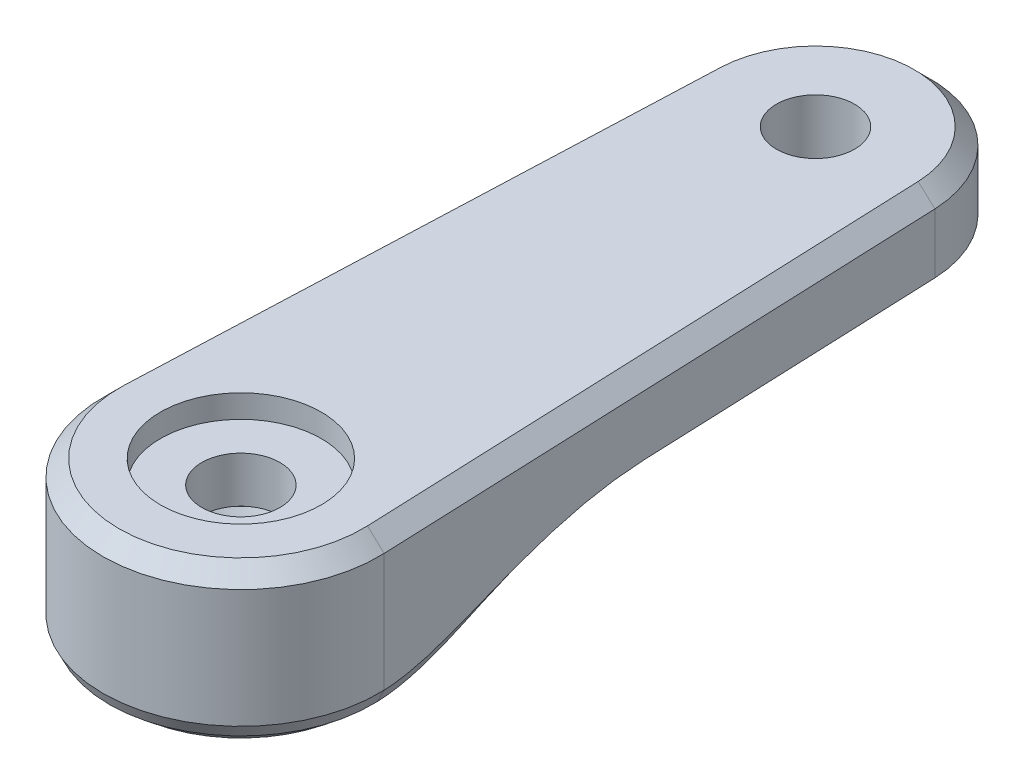
ISO-10303-21;
HEADER;
FILE_DESCRIPTION(('STEP AP214'),'2;1');
FILE_NAME('part.step','',(''),(''),'','','');
FILE_SCHEMA(('AUTOMOTIVE_DESIGN { 1 0 10303 214 1 1 1 1 }'));
ENDSEC;
DATA;
#1=APPLICATION_CONTEXT('core data for automotive mechanical design processes');
#2=APPLICATION_PROTOCOL_DEFINITION('international standard','automotive_design',2000,#1);
#3=PRODUCT_CONTEXT('',#1,'mechanical');
#4=PRODUCT('Part','Part','',(#3));
#5=PRODUCT_RELATED_PRODUCT_CATEGORY('part','',(#4));
#6=PRODUCT_DEFINITION_FORMATION('','',#4);
#7=PRODUCT_DEFINITION_CONTEXT('part definition',#1,'design');
#8=PRODUCT_DEFINITION('design','',#6,#7);
#9=PRODUCT_DEFINITION_SHAPE('','',#8);
#10=(LENGTH_UNIT() NAMED_UNIT(*) SI_UNIT(.MILLI.,.METRE.));
#11=(NAMED_UNIT(*) PLANE_ANGLE_UNIT() SI_UNIT($,.RADIAN.));
#12=(NAMED_UNIT(*) SI_UNIT($,.STERADIAN.) SOLID_ANGLE_UNIT());
#13=UNCERTAINTY_MEASURE_WITH_UNIT(LENGTH_MEASURE(1.E-05),#10,'distance_accuracy_value','');
#14=(GEOMETRIC_REPRESENTATION_CONTEXT(3) GLOBAL_UNCERTAINTY_ASSIGNED_CONTEXT((#13)) GLOBAL_UNIT_ASSIGNED_CONTEXT((#10,
#11,#12)) REPRESENTATION_CONTEXT('',''));
#15=CARTESIAN_POINT('',(0.,0.,0.));
#16=DIRECTION('',(0.,0.,1.));
#17=DIRECTION('',(1.,0.,0.));
#18=AXIS2_PLACEMENT_3D('',#15,#16,#17);
#19=CARTESIAN_POINT('',(0.,1.,0.));
#20=DIRECTION('',(0.,-1.,0.));
#21=DIRECTION('',(0.,0.,-1.));
#22=AXIS2_PLACEMENT_3D('',#19,#20,#21);
#23=CYLINDRICAL_SURFACE('',#22,3.25);
#24=CARTESIAN_POINT('',(0.,0.,0.));
#25=DIRECTION('',(0.,1.,0.));
#26=DIRECTION('',(0.,0.,1.));
#27=AXIS2_PLACEMENT_3D('',#24,#25,#26);
#28=CIRCLE('',#27,3.25);
#29=CARTESIAN_POINT('',(0.,0.,3.25));
#30=VERTEX_POINT('',#29);
#31=EDGE_CURVE('E260',#30,#30,#28,.T.);
#32=ORIENTED_EDGE('',*,*,#31,.T.);
#33=EDGE_LOOP('',(#32));
#34=FACE_BOUND('',#33,.T.);
#35=CARTESIAN_POINT('',(0.,-0.1,0.));
#36=DIRECTION('',(0.,1.,0.));
#37=DIRECTION('',(0.,0.,1.));
#38=AXIS2_PLACEMENT_3D('',#35,#36,#37);
#39=CIRCLE('',#38,3.25);
#40=CARTESIAN_POINT('',(0.,-0.1,3.25));
#41=VERTEX_POINT('',#40);
#42=EDGE_CURVE('E257',#41,#41,#39,.T.);
#43=ORIENTED_EDGE('',*,*,#42,.F.);
#44=EDGE_LOOP('',(#43));
#45=FACE_BOUND('',#44,.T.);
#46=ADVANCED_FACE('F39',(#34,#45),#23,.F.);
#47=CARTESIAN_POINT('',(0.,-1.,0.));
#48=DIRECTION('',(0.,1.,0.));
#49=DIRECTION('',(0.,0.,1.));
#50=AXIS2_PLACEMENT_3D('',#47,#48,#49);
#51=CIRCLE('',#50,3.25);
#52=CARTESIAN_POINT('',(0.,-1.,3.25));
#53=VERTEX_POINT('',#52);
#54=EDGE_CURVE('E251',#53,#53,#51,.T.);
#55=ORIENTED_EDGE('',*,*,#54,.T.);
#56=EDGE_LOOP('',(#55));
#57=FACE_BOUND('',#56,.T.);
#58=CARTESIAN_POINT('',(0.,-1.1,0.));
#59=DIRECTION('',(0.,1.,0.));
#60=DIRECTION('',(0.,0.,1.));
#61=AXIS2_PLACEMENT_3D('',#58,#59,#60);
#62=CIRCLE('',#61,3.25);
#63=CARTESIAN_POINT('',(0.,-1.1,3.25));
#64=VERTEX_POINT('',#63);
#65=EDGE_CURVE('E248',#64,#64,#62,.T.);
#66=ORIENTED_EDGE('',*,*,#65,.F.);
#67=EDGE_LOOP('',(#66));
#68=FACE_BOUND('',#67,.T.);
#69=ADVANCED_FACE('F293',(#57,#68),#23,.F.);
#70=CARTESIAN_POINT('',(0.,-2.,0.));
#71=DIRECTION('',(0.,1.,0.));
#72=DIRECTION('',(0.,0.,1.));
#73=AXIS2_PLACEMENT_3D('',#70,#71,#72);
#74=CIRCLE('',#73,3.25);
#75=CARTESIAN_POINT('',(0.,-2.,3.25));
#76=VERTEX_POINT('',#75);
#77=EDGE_CURVE('E242',#76,#76,#74,.T.);
#78=ORIENTED_EDGE('',*,*,#77,.T.);
#79=EDGE_LOOP('',(#78));
#80=FACE_BOUND('',#79,.T.);
#81=CARTESIAN_POINT('',(0.,-2.1,0.));
#82=DIRECTION('',(0.,1.,0.));
#83=DIRECTION('',(0.,0.,1.));
#84=AXIS2_PLACEMENT_3D('',#81,#82,#83);
#85=CIRCLE('',#84,3.25);
#86=CARTESIAN_POINT('',(0.,-2.1,3.25));
#87=VERTEX_POINT('',#86);
#88=EDGE_CURVE('E239',#87,#87,#85,.T.);
#89=ORIENTED_EDGE('',*,*,#88,.F.);
#90=EDGE_LOOP('',(#89));
#91=FACE_BOUND('',#90,.T.);
#92=ADVANCED_FACE('F279',(#80,#91),#23,.F.);
#93=CARTESIAN_POINT('',(4.82368620758527,0.,-12.0043571549121));
#94=CARTESIAN_POINT('',(4.94338851068404,0.,-10.0634695586143));
#95=CARTESIAN_POINT('',(5.07594055195461,-0.397684378236048,-8.18478007486543));
#96=CARTESIAN_POINT('',(5.3198478559393,-1.27346833512175,-5.33917345562958));
#97=CARTESIAN_POINT('',(5.40950195858683,-1.61061417195112,-4.38940425472756));
#98=CARTESIAN_POINT('',(5.58626452128897,-2.18526673724699,-2.39625380594028));
#99=CARTESIAN_POINT('',(5.6722399935338,-2.41224885445879,-1.33126546663375));
#100=CARTESIAN_POINT('',(5.71637241121808,-2.41224885403896,-0.228838040167665));
#101=CARTESIAN_POINT('',(5.52312598340589,0.699999999999999,-12.0323571549121));
#102=CARTESIAN_POINT('',(5.60451937238777,0.699999996656655,-9.99915094981327));
#103=CARTESIAN_POINT('',(5.68329383731126,0.279117362129691,-8.03136544672486));
#104=CARTESIAN_POINT('',(5.79910758708902,-0.647753985885276,-5.13833890452838));
#105=CARTESIAN_POINT('',(5.83714343100318,-1.00456667029147,-4.18820382808308));
#106=CARTESIAN_POINT('',(5.91446835581194,-1.61274062527653,-2.256627825455));
#107=CARTESIAN_POINT('',(5.95442346657631,-1.85296337216114,-1.25854947845791));
#108=CARTESIAN_POINT('',(5.99519807846246,-1.85296337052456,-0.239999999999994));
#109=B_SPLINE_SURFACE_WITH_KNOTS('',1,3,((#93,#94,#95,#96,#97,#98,#99,#100),(#101,#102,#103,
#104,#105,#106,#107,#108)),.UNSPECIFIED.,.F.,.F.,.F.,(2,2),(4,2,2,4),(0.,1.),
(0.0140089881501336,0.0200351825809354,0.0230482797963363,0.0260613770117372),.UNSPECIFIED.);
#110=CARTESIAN_POINT('',(5.99519807846246,-1.85296337052456,-0.239999999999994));
#111=CARTESIAN_POINT('',(5.71637241121808,-2.41224885403896,-0.228838040167665));
#112=B_SPLINE_CURVE_WITH_KNOTS('',1,(#110,#111),.UNSPECIFIED.,.F.,.F.,(2,2),(0.,1.),.UNSPECIFIED.);
#113=CARTESIAN_POINT('',(5.71637241121808,-2.41224885403896,-0.228838040167665));
#114=VERTEX_POINT('',#113);
#115=CARTESIAN_POINT('',(5.99519807846247,-1.85296337052452,-0.239999999999994));
#116=VERTEX_POINT('',#115);
#117=EDGE_CURVE('E129',#114,#116,#112,.F.);
#118=CARTESIAN_POINT('',(5.71637241121808,-2.41224885403896,-0.228838040167665));
#119=CARTESIAN_POINT('',(5.6722399935338,-2.41224885445879,-1.33126546663375));
#120=CARTESIAN_POINT('',(5.58626452128897,-2.18526673724699,-2.39625380594028));
#121=CARTESIAN_POINT('',(5.40950195858683,-1.61061417195112,-4.38940425472756));
#122=CARTESIAN_POINT('',(5.3198478559393,-1.27346833512175,-5.33917345562958));
#123=CARTESIAN_POINT('',(5.07594055195461,-0.397684378236048,-8.18478007486543));
#124=CARTESIAN_POINT('',(4.94338851068404,0.,-10.0634695586143));
#125=CARTESIAN_POINT('',(4.82368620758527,0.,-12.0043571549121));
#126=B_SPLINE_CURVE_WITH_KNOTS('',3,(#118,#119,#120,#121,#122,#123,#124,#125),.UNSPECIFIED.,.F.,
.F.,(4,2,2,4),(0.0140089881501336,0.0170220853655345,0.0200351825809354,0.0260613770117372),.UNSPECIFIED.);
#127=CARTESIAN_POINT('',(4.82368620758527,0.,-12.0043571549121));
#128=VERTEX_POINT('',#127);
#129=EDGE_CURVE('E145',#128,#114,#126,.F.);
#130=CARTESIAN_POINT('',(4.82368620758527,0.,-12.0043571549121));
#131=CARTESIAN_POINT('',(5.52312598340589,0.699999999999999,-12.0323571549121));
#132=B_SPLINE_CURVE_WITH_KNOTS('',1,(#130,#131),.UNSPECIFIED.,.F.,.F.,(2,2),(0.,1.),.UNSPECIFIED.);
#133=CARTESIAN_POINT('',(5.52312598340589,0.699999999999999,-12.0323571549121));
#134=VERTEX_POINT('',#133);
#135=EDGE_CURVE('E116',#128,#134,#132,.T.);
#136=CARTESIAN_POINT('',(5.52312598340589,0.699999999999999,-12.0323571549121));
#137=CARTESIAN_POINT('',(5.60451937238777,0.699999996656655,-9.99915094981327));
#138=CARTESIAN_POINT('',(5.68329383731126,0.279117362129691,-8.03136544672486));
#139=CARTESIAN_POINT('',(5.79910758708902,-0.647753985885276,-5.13833890452838));
#140=CARTESIAN_POINT('',(5.83714343100318,-1.00456667029147,-4.18820382808308));
#141=CARTESIAN_POINT('',(5.91446835581194,-1.61274062527653,-2.256627825455));
#142=CARTESIAN_POINT('',(5.95442346657631,-1.85296337216114,-1.25854947845791));
#143=CARTESIAN_POINT('',(5.99519807846246,-1.85296337052456,-0.239999999999994));
#144=B_SPLINE_CURVE_WITH_KNOTS('',3,(#136,#137,#138,#139,#140,#141,#142,#143),.UNSPECIFIED.,.F.,
.F.,(4,2,2,4),(0.0140089881501336,0.0200351825809354,0.0230482797963363,0.0260613770117372),.UNSPECIFIED.);
#145=EDGE_CURVE('E342',#116,#134,#144,.F.);
#146=ORIENTED_EDGE('',*,*,#117,.F.);
#147=ORIENTED_EDGE('',*,*,#129,.F.);
#148=ORIENTED_EDGE('',*,*,#135,.T.);
#149=ORIENTED_EDGE('',*,*,#145,.F.);
#150=EDGE_LOOP('',(#146,#147,#148,#149));
#151=FACE_BOUND('',#150,.T.);
#152=ADVANCED_FACE('F147',(#151),#109,.T.);
#153=CARTESIAN_POINT('',(5.29575830264185,0.,-0.212000000000001));
#154=DIRECTION('',(-0.706540869306228,0.707106781186547,0.028284271247462));
#155=DIRECTION('',(0.0400000000000001,0.,0.999199679743744));
#156=AXIS2_PLACEMENT_3D('',#153,#154,#155);
#157=PLANE('',#156);
#158=ORIENTED_EDGE('',*,*,#135,.F.);
#159=DIRECTION('',(0.0400000000000001,0.,0.999199679743744));
#160=VECTOR('',#159,1.);
#161=CARTESIAN_POINT('',(5.29575830264184,0.,-0.212000000000001));
#162=LINE('',#161,#160);
#163=CARTESIAN_POINT('',(4.2965586228981,0.,-25.172));
#164=VERTEX_POINT('',#163);
#165=EDGE_CURVE('E121',#164,#128,#162,.T.);
#166=ORIENTED_EDGE('',*,*,#165,.F.);
#167=DIRECTION('',(0.706540869306229,0.707106781186546,-0.0282842712474622));
#168=VECTOR('',#167,1.);
#169=CARTESIAN_POINT('',(4.2965586228981,0.,-25.172));
#170=LINE('',#169,#168);
#171=CARTESIAN_POINT('',(4.99599839871872,0.700000000000013,-25.2));
#172=VERTEX_POINT('',#171);
#173=EDGE_CURVE('E130',#164,#172,#170,.T.);
#174=ORIENTED_EDGE('',*,*,#173,.T.);
#175=DIRECTION('',(-0.0400000000000001,0.,-0.999199679743744));
#176=VECTOR('',#175,1.);
#177=CARTESIAN_POINT('',(5.99519807846247,0.699999999999999,-0.239999999999994));
#178=LINE('',#177,#176);
#179=EDGE_CURVE('E123',#134,#172,#178,.T.);
#180=ORIENTED_EDGE('',*,*,#179,.F.);
#181=EDGE_LOOP('',(#158,#166,#174,#180));
#182=FACE_BOUND('',#181,.T.);
#183=ADVANCED_FACE('F119',(#182),#157,.F.);
#184=CARTESIAN_POINT('',(0.,0.,-25.));
#185=DIRECTION('',(0.,1.,0.));
#186=DIRECTION('',(0.,0.,1.));
#187=AXIS2_PLACEMENT_3D('',#184,#185,#186);
#188=CONICAL_SURFACE('',#187,4.3,0.78539816339745);
#189=ORIENTED_EDGE('',*,*,#173,.F.);
#190=CARTESIAN_POINT('',(0.,0.,-25.));
#191=DIRECTION('',(0.,1.,0.));
#192=DIRECTION('',(0.,0.,1.));
#193=AXIS2_PLACEMENT_3D('',#190,#191,#192);
#194=CIRCLE('',#193,4.3);
#195=CARTESIAN_POINT('',(-4.2965586228981,0.,-25.172));
#196=VERTEX_POINT('',#195);
#197=EDGE_CURVE('E141',#196,#164,#194,.F.);
#198=ORIENTED_EDGE('',*,*,#197,.F.);
#199=DIRECTION('',(-0.706540869306228,0.707106781186546,-0.028284271247462));
#200=VECTOR('',#199,1.);
#201=CARTESIAN_POINT('',(-4.2965586228981,0.,-25.172));
#202=LINE('',#201,#200);
#203=CARTESIAN_POINT('',(-4.99599839871872,0.700000000000013,-25.2));
#204=VERTEX_POINT('',#203);
#205=EDGE_CURVE('E467',#196,#204,#202,.T.);
#206=ORIENTED_EDGE('',*,*,#205,.T.);
#207=CARTESIAN_POINT('',(0.,0.700000000000006,-25.));
#208=DIRECTION('',(0.,1.,0.));
#209=DIRECTION('',(0.,0.,1.));
#210=AXIS2_PLACEMENT_3D('',#207,#208,#209);
#211=CIRCLE('',#210,5.);
#212=EDGE_CURVE('E337',#172,#204,#211,.T.);
#213=ORIENTED_EDGE('',*,*,#212,.F.);
#214=EDGE_LOOP('',(#189,#198,#206,#213));
#215=FACE_BOUND('',#214,.T.);
#216=ADVANCED_FACE('F534',(#215),#188,.T.);
#217=CARTESIAN_POINT('',(-5.29575830264184,0.,-0.212));
#218=DIRECTION('',(0.706540869306227,0.707106781186548,0.0282842712474619));
#219=DIRECTION('',(0.0400000000000001,0.,-0.999199679743744));
#220=AXIS2_PLACEMENT_3D('',#217,#218,#219);
#221=PLANE('',#220);
#222=ORIENTED_EDGE('',*,*,#205,.F.);
#223=DIRECTION('',(0.0400000000000001,0.,-0.999199679743744));
#224=VECTOR('',#223,1.);
#225=CARTESIAN_POINT('',(-5.29575830264184,0.,-0.212));
#226=LINE('',#225,#224);
#227=CARTESIAN_POINT('',(-4.82368620758532,0.,-12.0043571549121));
#228=VERTEX_POINT('',#227);
#229=EDGE_CURVE('E335',#228,#196,#226,.T.);
#230=ORIENTED_EDGE('',*,*,#229,.F.);
#231=CARTESIAN_POINT('',(-5.52312598340589,0.7,-12.0323571549121));
#232=CARTESIAN_POINT('',(-4.82368620758527,0.,-12.0043571549121));
#233=B_SPLINE_CURVE_WITH_KNOTS('',1,(#231,#232),.UNSPECIFIED.,.F.,.F.,(2,2),(0.,1.),.UNSPECIFIED.);
#234=CARTESIAN_POINT('',(-5.52312598340589,0.7,-12.0323571549121));
#235=VERTEX_POINT('',#234);
#236=EDGE_CURVE('E468',#228,#235,#233,.F.);
#237=ORIENTED_EDGE('',*,*,#236,.T.);
#238=DIRECTION('',(-0.0400000000000001,0.,0.999199679743744));
#239=VECTOR('',#238,1.);
#240=CARTESIAN_POINT('',(-4.99599839871872,0.699999999999999,-25.2));
#241=LINE('',#240,#239);
#242=EDGE_CURVE('E321',#204,#235,#241,.T.);
#243=ORIENTED_EDGE('',*,*,#242,.F.);
#244=EDGE_LOOP('',(#222,#230,#237,#243));
#245=FACE_BOUND('',#244,.T.);
#246=ADVANCED_FACE('F465',(#245),#221,.F.);
#247=CARTESIAN_POINT('',(-5.52312598340589,0.7,-12.0323571549121));
#248=CARTESIAN_POINT('',(-5.60451937238774,0.699999996658421,-9.99915094981404));
#249=CARTESIAN_POINT('',(-5.68329383731131,0.279117362131469,-8.0313654467238));
#250=CARTESIAN_POINT('',(-5.799107587089,-0.647753985886167,-5.13833890452891));
#251=CARTESIAN_POINT('',(-5.8371434310032,-1.0045666702903,-4.18820382808257));
#252=CARTESIAN_POINT('',(-5.91446835581193,-1.61274062527771,-2.2566278254555));
#253=CARTESIAN_POINT('',(-5.95442346657633,-1.85296337216047,-1.25854947845753));
#254=CARTESIAN_POINT('',(-5.99519807846246,-1.85296337052456,-0.240000000000001));
#255=CARTESIAN_POINT('',(-4.82368620758527,0.,-12.0043571549121));
#256=CARTESIAN_POINT('',(-4.94338851068633,0.,-10.0634695586148));
#257=CARTESIAN_POINT('',(-5.07594055195575,-0.397684378235894,-8.18478007486496));
#258=CARTESIAN_POINT('',(-5.31984785593873,-1.27346833512183,-5.33917345562982));
#259=CARTESIAN_POINT('',(-5.40950195858764,-1.61061417195074,-4.38940425472735));
#260=CARTESIAN_POINT('',(-5.58626452128815,-2.18526673724737,-2.39625380594048));
#261=CARTESIAN_POINT('',(-5.672239993533,-2.4122488544594,-1.33126546663355));
#262=CARTESIAN_POINT('',(-5.71637241121808,-2.41224885403895,-0.228838040167673));
#263=B_SPLINE_SURFACE_WITH_KNOTS('',1,3,((#247,#248,#249,#250,#251,#252,#253,#254),(#255,#256,
#257,#258,#259,#260,#261,#262)),.UNSPECIFIED.,.F.,.F.,.F.,(2,2),(4,2,2,4),(0.,1.),(0.,
0.0060247065854721,0.00903705987820815,0.0120494131709442),.UNSPECIFIED.);
#264=CARTESIAN_POINT('',(-4.82368620758527,0.,-12.0043571549121));
#265=CARTESIAN_POINT('',(-4.94338851068633,0.,-10.0634695586148));
#266=CARTESIAN_POINT('',(-5.07594055195575,-0.397684378235894,-8.18478007486496));
#267=CARTESIAN_POINT('',(-5.31984785593873,-1.27346833512183,-5.33917345562982));
#268=CARTESIAN_POINT('',(-5.40950195858764,-1.61061417195074,-4.38940425472735));
#269=CARTESIAN_POINT('',(-5.58626452128815,-2.18526673724737,-2.39625380594048));
#270=CARTESIAN_POINT('',(-5.672239993533,-2.4122488544594,-1.33126546663355));
#271=CARTESIAN_POINT('',(-5.71637241121808,-2.41224885403895,-0.228838040167673));
#272=B_SPLINE_CURVE_WITH_KNOTS('',3,(#264,#265,#266,#267,#268,#269,#270,#271),.UNSPECIFIED.,.F.,
.F.,(4,2,2,4),(0.,0.0060247065854721,0.00903705987820815,0.0120494131709442),.UNSPECIFIED.);
#273=CARTESIAN_POINT('',(-5.71637241121807,-2.41224885403896,-0.228838040167671));
#274=VERTEX_POINT('',#273);
#275=EDGE_CURVE('E161',#274,#228,#272,.F.);
#276=CARTESIAN_POINT('',(-5.71637241121808,-2.41224885403895,-0.228838040167673));
#277=CARTESIAN_POINT('',(-5.99519807846246,-1.85296337052456,-0.240000000000001));
#278=B_SPLINE_CURVE_WITH_KNOTS('',1,(#276,#277),.UNSPECIFIED.,.F.,.F.,(2,2),(0.,1.),.UNSPECIFIED.);
#279=CARTESIAN_POINT('',(-5.99519807846246,-1.85296337052452,-0.240000000000001));
#280=VERTEX_POINT('',#279);
#281=EDGE_CURVE('E396',#274,#280,#278,.T.);
#282=CARTESIAN_POINT('',(-5.99519807846246,-1.85296337052456,-0.240000000000001));
#283=CARTESIAN_POINT('',(-5.95442346657633,-1.85296337216047,-1.25854947845753));
#284=CARTESIAN_POINT('',(-5.91446835581193,-1.61274062527771,-2.2566278254555));
#285=CARTESIAN_POINT('',(-5.8371434310032,-1.0045666702903,-4.18820382808257));
#286=CARTESIAN_POINT('',(-5.799107587089,-0.647753985886167,-5.13833890452891));
#287=CARTESIAN_POINT('',(-5.68329383731131,0.279117362131469,-8.0313654467238));
#288=CARTESIAN_POINT('',(-5.60451937238774,0.699999996658421,-9.99915094981404));
#289=CARTESIAN_POINT('',(-5.52312598340589,0.7,-12.0323571549121));
#290=B_SPLINE_CURVE_WITH_KNOTS('',3,(#282,#283,#284,#285,#286,#287,#288,#289),.UNSPECIFIED.,.F.,
.F.,(4,2,2,4),(0.,0.00301235329273605,0.0060247065854721,0.0120494131709442),.UNSPECIFIED.);
#291=EDGE_CURVE('E142',#235,#280,#290,.F.);
#292=ORIENTED_EDGE('',*,*,#236,.F.);
#293=ORIENTED_EDGE('',*,*,#275,.F.);
#294=ORIENTED_EDGE('',*,*,#281,.T.);
#295=ORIENTED_EDGE('',*,*,#291,.F.);
#296=EDGE_LOOP('',(#292,#293,#294,#295));
#297=FACE_BOUND('',#296,.T.);
#298=ADVANCED_FACE('F473',(#297),#263,.T.);
#299=CARTESIAN_POINT('',(0.,-2.41224885403895,0.));
#300=DIRECTION('',(0.,1.,0.));
#301=DIRECTION('',(0.,0.,1.));
#302=AXIS2_PLACEMENT_3D('',#299,#300,#301);
#303=CONICAL_SURFACE('',#302,5.72095100419179,0.462797956274184);
#304=CARTESIAN_POINT('',(0.,-2.41224885403895,0.));
#305=DIRECTION('',(0.,-1.,0.));
#306=DIRECTION('',(0.,0.,-1.));
#307=AXIS2_PLACEMENT_3D('',#304,#305,#306);
#308=CIRCLE('',#307,5.72095100419179);
#309=EDGE_CURVE('E154',#114,#274,#308,.T.);
#310=ORIENTED_EDGE('',*,*,#309,.F.);
#311=ORIENTED_EDGE('',*,*,#117,.T.);
#312=CARTESIAN_POINT('',(0.,-1.85296337052457,0.));
#313=DIRECTION('',(0.,1.,0.));
#314=DIRECTION('',(0.,0.,1.));
#315=AXIS2_PLACEMENT_3D('',#312,#313,#314);
#316=CIRCLE('',#315,6.);
#317=EDGE_CURVE('E329',#280,#116,#316,.T.);
#318=ORIENTED_EDGE('',*,*,#317,.F.);
#319=ORIENTED_EDGE('',*,*,#281,.F.);
#320=EDGE_LOOP('',(#310,#311,#318,#319));
#321=FACE_BOUND('',#320,.T.);
#322=ADVANCED_FACE('F367',(#321),#303,.T.);
#323=CARTESIAN_POINT('',(0.,4.,0.));
#324=DIRECTION('',(0.,-1.,0.));
#325=DIRECTION('',(0.,0.,-1.));
#326=AXIS2_PLACEMENT_3D('',#323,#324,#325);
#327=CYLINDRICAL_SURFACE('',#326,6.);
#328=DIRECTION('',(0.,-1.,0.));
#329=VECTOR('',#328,1.);
#330=CARTESIAN_POINT('',(5.99519807846247,36.0846879367713,-0.239999999999994));
#331=LINE('',#330,#329);
#332=CARTESIAN_POINT('',(5.99519807846247,3.30000000000001,-0.239999999999994));
#333=VERTEX_POINT('',#332);
#334=EDGE_CURVE('E207',#333,#116,#331,.T.);
#335=ORIENTED_EDGE('',*,*,#334,.F.);
#336=CARTESIAN_POINT('',(0.,3.3,0.));
#337=DIRECTION('',(0.,1.,0.));
#338=DIRECTION('',(0.,0.,1.));
#339=AXIS2_PLACEMENT_3D('',#336,#337,#338);
#340=CIRCLE('',#339,6.);
#341=CARTESIAN_POINT('',(-5.99519807846246,3.30000000000001,-0.240000000000001));
#342=VERTEX_POINT('',#341);
#343=EDGE_CURVE('E212',#333,#342,#340,.F.);
#344=ORIENTED_EDGE('',*,*,#343,.T.);
#345=DIRECTION('',(0.,-1.,0.));
#346=VECTOR('',#345,1.);
#347=CARTESIAN_POINT('',(-5.99519807846246,36.0846879367713,-0.240000000000001));
#348=LINE('',#347,#346);
#349=EDGE_CURVE('E203',#342,#280,#348,.T.);
#350=ORIENTED_EDGE('',*,*,#349,.T.);
#351=ORIENTED_EDGE('',*,*,#317,.T.);
#352=EDGE_LOOP('',(#335,#344,#350,#351));
#353=FACE_BOUND('',#352,.T.);
#354=ADVANCED_FACE('F360',(#353),#327,.T.);
#355=CARTESIAN_POINT('',(0.,4.,0.));
#356=DIRECTION('',(0.,1.,0.));
#357=DIRECTION('',(0.,0.,1.));
#358=AXIS2_PLACEMENT_3D('',#355,#356,#357);
#359=PLANE('',#358);
#360=CARTESIAN_POINT('',(0.,4.,-25.));
#361=DIRECTION('',(0.,1.,0.));
#362=DIRECTION('',(0.,0.,1.));
#363=AXIS2_PLACEMENT_3D('',#360,#361,#362);
#364=CIRCLE('',#363,4.3);
#365=CARTESIAN_POINT('',(4.2965586228981,4.,-25.172));
#366=VERTEX_POINT('',#365);
#367=CARTESIAN_POINT('',(-4.2965586228981,4.,-25.172));
#368=VERTEX_POINT('',#367);
#369=EDGE_CURVE('E448',#366,#368,#364,.T.);
#370=ORIENTED_EDGE('',*,*,#369,.T.);
#371=DIRECTION('',(-0.0400000000000001,0.,0.999199679743744));
#372=VECTOR('',#371,1.);
#373=CARTESIAN_POINT('',(-5.29575830264184,4.,-0.212));
#374=LINE('',#373,#372);
#375=CARTESIAN_POINT('',(-5.29575830264184,4.,-0.212000000000001));
#376=VERTEX_POINT('',#375);
#377=EDGE_CURVE('E452',#368,#376,#374,.T.);
#378=ORIENTED_EDGE('',*,*,#377,.T.);
#379=CARTESIAN_POINT('',(0.,4.,0.));
#380=DIRECTION('',(0.,1.,0.));
#381=DIRECTION('',(0.,0.,1.));
#382=AXIS2_PLACEMENT_3D('',#379,#380,#381);
#383=CIRCLE('',#382,5.3);
#384=CARTESIAN_POINT('',(5.29575830264185,4.,-0.211999999999995));
#385=VERTEX_POINT('',#384);
#386=EDGE_CURVE('E450',#376,#385,#383,.T.);
#387=ORIENTED_EDGE('',*,*,#386,.T.);
#388=DIRECTION('',(-0.0400000000000001,0.,-0.999199679743744));
#389=VECTOR('',#388,1.);
#390=CARTESIAN_POINT('',(4.2965586228981,4.,-25.172));
#391=LINE('',#390,#389);
#392=EDGE_CURVE('E399',#385,#366,#391,.T.);
#393=ORIENTED_EDGE('',*,*,#392,.T.);
#394=EDGE_LOOP('',(#370,#378,#387,#393));
#395=FACE_BOUND('',#394,.T.);
#396=CARTESIAN_POINT('',(0.,4.,0.));
#397=DIRECTION('',(0.,1.,0.));
#398=DIRECTION('',(0.,0.,1.));
#399=AXIS2_PLACEMENT_3D('',#396,#397,#398);
#400=CIRCLE('',#399,3.5);
#401=CARTESIAN_POINT('',(0.,4.,3.5));
#402=VERTEX_POINT('',#401);
#403=EDGE_CURVE('E226',#402,#402,#400,.T.);
#404=ORIENTED_EDGE('',*,*,#403,.F.);
#405=EDGE_LOOP('',(#404));
#406=FACE_BOUND('',#405,.T.);
#407=CARTESIAN_POINT('',(0.,4.,-25.));
#408=DIRECTION('',(0.,1.,0.));
#409=DIRECTION('',(0.,0.,1.));
#410=AXIS2_PLACEMENT_3D('',#407,#408,#409);
#411=CIRCLE('',#410,1.7);
#412=CARTESIAN_POINT('',(0.,4.,-23.3));
#413=VERTEX_POINT('',#412);
#414=EDGE_CURVE('E200',#413,#413,#411,.T.);
#415=ORIENTED_EDGE('',*,*,#414,.F.);
#416=EDGE_LOOP('',(#415));
#417=FACE_BOUND('',#416,.T.);
#418=ADVANCED_FACE('F357',(#395,#406,#417),#359,.T.);
#419=CARTESIAN_POINT('',(0.,0.,0.));
#420=DIRECTION('',(0.,1.,0.));
#421=DIRECTION('',(0.,0.,1.));
#422=AXIS2_PLACEMENT_3D('',#419,#420,#421);
#423=PLANE('',#422);
#424=CARTESIAN_POINT('',(0.,0.,-25.));
#425=DIRECTION('',(0.,-1.,0.));
#426=DIRECTION('',(0.,0.,-1.));
#427=AXIS2_PLACEMENT_3D('',#424,#425,#426);
#428=CIRCLE('',#427,3.5);
#429=CARTESIAN_POINT('',(0.,0.,-28.5));
#430=VERTEX_POINT('',#429);
#431=EDGE_CURVE('E184',#430,#430,#428,.T.);
#432=ORIENTED_EDGE('',*,*,#431,.F.);
#433=EDGE_LOOP('',(#432));
#434=FACE_BOUND('',#433,.T.);
#435=CARTESIAN_POINT('',(0.,0.,0.));
#436=DIRECTION('',(0.,1.,0.));
#437=DIRECTION('',(0.,0.,1.));
#438=AXIS2_PLACEMENT_3D('',#435,#436,#437);
#439=CIRCLE('',#438,12.9372539331938);
#440=EDGE_CURVE('E139',#128,#228,#439,.T.);
#441=ORIENTED_EDGE('',*,*,#440,.T.);
#442=ORIENTED_EDGE('',*,*,#229,.T.);
#443=ORIENTED_EDGE('',*,*,#197,.T.);
#444=ORIENTED_EDGE('',*,*,#165,.T.);
#445=EDGE_LOOP('',(#441,#442,#443,#444));
#446=FACE_BOUND('',#445,.T.);
#447=ADVANCED_FACE('F136',(#434,#446),#423,.F.);
#448=CARTESIAN_POINT('',(5.99519807846247,36.0846879367713,-0.239999999999994));
#449=DIRECTION('',(-0.999199679743744,0.,0.0400000000000001));
#450=DIRECTION('',(0.0400000000000001,0.,0.999199679743744));
#451=AXIS2_PLACEMENT_3D('',#448,#449,#450);
#452=PLANE('',#451);
#453=DIRECTION('',(0.,-1.,0.));
#454=VECTOR('',#453,1.);
#455=CARTESIAN_POINT('',(4.99599839871872,36.0846879367713,-25.2));
#456=LINE('',#455,#454);
#457=CARTESIAN_POINT('',(4.99599839871872,3.30000000000001,-25.2));
#458=VERTEX_POINT('',#457);
#459=EDGE_CURVE('E165',#458,#172,#456,.T.);
#460=ORIENTED_EDGE('',*,*,#459,.F.);
#461=DIRECTION('',(0.0400000000000001,0.,0.999199679743744));
#462=VECTOR('',#461,1.);
#463=CARTESIAN_POINT('',(5.99519807846247,3.3,-0.240000000000001));
#464=LINE('',#463,#462);
#465=EDGE_CURVE('E14',#458,#333,#464,.T.);
#466=ORIENTED_EDGE('',*,*,#465,.T.);
#467=ORIENTED_EDGE('',*,*,#334,.T.);
#468=ORIENTED_EDGE('',*,*,#145,.T.);
#469=ORIENTED_EDGE('',*,*,#179,.T.);
#470=EDGE_LOOP('',(#460,#466,#467,#468,#469));
#471=FACE_BOUND('',#470,.T.);
#472=ADVANCED_FACE('F348',(#471),#452,.F.);
#473=CARTESIAN_POINT('',(0.,36.0846879367713,-25.));
#474=DIRECTION('',(0.,-1.,0.));
#475=DIRECTION('',(0.,0.,-1.));
#476=AXIS2_PLACEMENT_3D('',#473,#474,#475);
#477=CYLINDRICAL_SURFACE('',#476,5.);
#478=DIRECTION('',(0.,-1.,0.));
#479=VECTOR('',#478,1.);
#480=CARTESIAN_POINT('',(-4.99599839871872,36.0846879367713,-25.2));
#481=LINE('',#480,#479);
#482=CARTESIAN_POINT('',(-4.99599839871872,3.30000000000001,-25.2));
#483=VERTEX_POINT('',#482);
#484=EDGE_CURVE('E163',#483,#204,#481,.T.);
#485=ORIENTED_EDGE('',*,*,#484,.F.);
#486=CARTESIAN_POINT('',(0.,3.3,-25.));
#487=DIRECTION('',(0.,1.,0.));
#488=DIRECTION('',(0.,0.,1.));
#489=AXIS2_PLACEMENT_3D('',#486,#487,#488);
#490=CIRCLE('',#489,5.);
#491=EDGE_CURVE('E48',#483,#458,#490,.F.);
#492=ORIENTED_EDGE('',*,*,#491,.T.);
#493=ORIENTED_EDGE('',*,*,#459,.T.);
#494=ORIENTED_EDGE('',*,*,#212,.T.);
#495=EDGE_LOOP('',(#485,#492,#493,#494));
#496=FACE_BOUND('',#495,.T.);
#497=ADVANCED_FACE('F311',(#496),#477,.T.);
#498=CARTESIAN_POINT('',(-4.99599839871872,36.0846879367713,-25.2));
#499=DIRECTION('',(0.999199679743744,0.,0.0400000000000001));
#500=DIRECTION('',(0.0400000000000001,0.,-0.999199679743744));
#501=AXIS2_PLACEMENT_3D('',#498,#499,#500);
#502=PLANE('',#501);
#503=ORIENTED_EDGE('',*,*,#349,.F.);
#504=DIRECTION('',(0.0400000000000001,0.,-0.999199679743744));
#505=VECTOR('',#504,1.);
#506=CARTESIAN_POINT('',(-4.99599839871872,3.3,-25.2));
#507=LINE('',#506,#505);
#508=EDGE_CURVE('E210',#342,#483,#507,.T.);
#509=ORIENTED_EDGE('',*,*,#508,.T.);
#510=ORIENTED_EDGE('',*,*,#484,.T.);
#511=ORIENTED_EDGE('',*,*,#242,.T.);
#512=ORIENTED_EDGE('',*,*,#291,.T.);
#513=EDGE_LOOP('',(#503,#509,#510,#511,#512));
#514=FACE_BOUND('',#513,.T.);
#515=ADVANCED_FACE('F307',(#514),#502,.F.);
#516=CARTESIAN_POINT('',(0.,4.,-25.));
#517=DIRECTION('',(0.,1.,0.));
#518=DIRECTION('',(0.,0.,1.));
#519=AXIS2_PLACEMENT_3D('',#516,#517,#518);
#520=CYLINDRICAL_SURFACE('',#519,1.7);
#521=CARTESIAN_POINT('',(0.,1.,-25.));
#522=DIRECTION('',(0.,1.,0.));
#523=DIRECTION('',(0.,0.,1.));
#524=AXIS2_PLACEMENT_3D('',#521,#522,#523);
#525=CIRCLE('',#524,1.7);
#526=CARTESIAN_POINT('',(0.,1.,-23.3));
#527=VERTEX_POINT('',#526);
#528=EDGE_CURVE('E176',#527,#527,#525,.F.);
#529=ORIENTED_EDGE('',*,*,#528,.T.);
#530=EDGE_LOOP('',(#529));
#531=FACE_BOUND('',#530,.T.);
#532=ORIENTED_EDGE('',*,*,#414,.T.);
#533=EDGE_LOOP('',(#532));
#534=FACE_BOUND('',#533,.T.);
#535=ADVANCED_FACE('F303',(#531,#534),#520,.F.);
#536=CARTESIAN_POINT('',(0.,-3.,0.));
#537=DIRECTION('',(0.,-1.,0.));
#538=DIRECTION('',(0.,0.,-1.));
#539=AXIS2_PLACEMENT_3D('',#536,#537,#538);
#540=PLANE('',#539);
#541=CARTESIAN_POINT('',(0.,-3.,0.));
#542=DIRECTION('',(0.,-1.,0.));
#543=DIRECTION('',(0.,0.,-1.));
#544=AXIS2_PLACEMENT_3D('',#541,#542,#543);
#545=CIRCLE('',#544,3.25);
#546=CARTESIAN_POINT('',(0.,-3.,-3.25));
#547=VERTEX_POINT('',#546);
#548=EDGE_CURVE('E182',#547,#547,#545,.T.);
#549=ORIENTED_EDGE('',*,*,#548,.F.);
#550=EDGE_LOOP('',(#549));
#551=FACE_BOUND('',#550,.T.);
#552=CARTESIAN_POINT('',(0.,-3.,0.));
#553=DIRECTION('',(0.,-1.,0.));
#554=DIRECTION('',(0.,0.,-1.));
#555=AXIS2_PLACEMENT_3D('',#552,#553,#554);
#556=CIRCLE('',#555,5.);
#557=CARTESIAN_POINT('',(0.,-3.,-5.));
#558=VERTEX_POINT('',#557);
#559=EDGE_CURVE('E195',#558,#558,#556,.T.);
#560=ORIENTED_EDGE('',*,*,#559,.T.);
#561=EDGE_LOOP('',(#560));
#562=FACE_BOUND('',#561,.T.);
#563=ADVANCED_FACE('F277',(#551,#562),#540,.T.);
#564=CARTESIAN_POINT('',(0.,0.9,0.));
#565=DIRECTION('',(0.,1.,0.));
#566=DIRECTION('',(0.,0.,1.));
#567=AXIS2_PLACEMENT_3D('',#564,#565,#566);
#568=CIRCLE('',#567,3.25);
#569=CARTESIAN_POINT('',(0.,0.9,3.25));
#570=VERTEX_POINT('',#569);
#571=EDGE_CURVE('E266',#570,#570,#568,.T.);
#572=ORIENTED_EDGE('',*,*,#571,.F.);
#573=EDGE_LOOP('',(#572));
#574=FACE_BOUND('',#573,.T.);
#575=CARTESIAN_POINT('',(0.,1.,0.));
#576=DIRECTION('',(0.,-1.,0.));
#577=DIRECTION('',(0.,0.,-1.));
#578=AXIS2_PLACEMENT_3D('',#575,#576,#577);
#579=CIRCLE('',#578,3.25);
#580=CARTESIAN_POINT('',(0.,1.,-3.25));
#581=VERTEX_POINT('',#580);
#582=EDGE_CURVE('E192',#581,#581,#579,.T.);
#583=ORIENTED_EDGE('',*,*,#582,.F.);
#584=EDGE_LOOP('',(#583));
#585=FACE_BOUND('',#584,.T.);
#586=ADVANCED_FACE('F273',(#574,#585),#23,.F.);
#587=CARTESIAN_POINT('',(0.,1.,0.));
#588=DIRECTION('',(0.,-1.,0.));
#589=DIRECTION('',(0.,0.,-1.));
#590=AXIS2_PLACEMENT_3D('',#587,#588,#589);
#591=PLANE('',#590);
#592=CARTESIAN_POINT('',(0.,1.,0.));
#593=DIRECTION('',(0.,-1.,0.));
#594=DIRECTION('',(0.,0.,-1.));
#595=AXIS2_PLACEMENT_3D('',#592,#593,#594);
#596=CIRCLE('',#595,1.7);
#597=CARTESIAN_POINT('',(0.,1.,-1.7));
#598=VERTEX_POINT('',#597);
#599=EDGE_CURVE('E174',#598,#598,#596,.T.);
#600=ORIENTED_EDGE('',*,*,#599,.F.);
#601=EDGE_LOOP('',(#600));
#602=FACE_BOUND('',#601,.T.);
#603=ORIENTED_EDGE('',*,*,#582,.T.);
#604=EDGE_LOOP('',(#603));
#605=FACE_BOUND('',#604,.T.);
#606=ADVANCED_FACE('F276',(#602,#605),#591,.T.);
#607=CARTESIAN_POINT('',(0.,-3.,0.));
#608=DIRECTION('',(0.,1.,0.));
#609=DIRECTION('',(0.,0.,1.));
#610=AXIS2_PLACEMENT_3D('',#607,#608,#609);
#611=CYLINDRICAL_SURFACE('',#610,1.7);
#612=CARTESIAN_POINT('',(0.,3.,0.));
#613=DIRECTION('',(0.,-1.,0.));
#614=DIRECTION('',(0.,0.,-1.));
#615=AXIS2_PLACEMENT_3D('',#612,#613,#614);
#616=CIRCLE('',#615,1.7);
#617=CARTESIAN_POINT('',(0.,3.,-1.7));
#618=VERTEX_POINT('',#617);
#619=EDGE_CURVE('E169',#618,#618,#616,.F.);
#620=ORIENTED_EDGE('',*,*,#619,.T.);
#621=EDGE_LOOP('',(#620));
#622=FACE_BOUND('',#621,.T.);
#623=ORIENTED_EDGE('',*,*,#599,.T.);
#624=EDGE_LOOP('',(#623));
#625=FACE_BOUND('',#624,.T.);
#626=ADVANCED_FACE('F283',(#622,#625),#611,.F.);
#627=CARTESIAN_POINT('',(0.,-12.,0.));
#628=DIRECTION('',(0.,1.,0.));
#629=DIRECTION('',(0.,0.,1.));
#630=AXIS2_PLACEMENT_3D('',#627,#628,#629);
#631=TOROIDAL_SURFACE('',#630,12.9372539331938,12.);
#632=ORIENTED_EDGE('',*,*,#309,.T.);
#633=ORIENTED_EDGE('',*,*,#275,.T.);
#634=ORIENTED_EDGE('',*,*,#440,.F.);
#635=ORIENTED_EDGE('',*,*,#129,.T.);
#636=EDGE_LOOP('',(#632,#633,#634,#635));
#637=FACE_BOUND('',#636,.T.);
#638=ORIENTED_EDGE('',*,*,#559,.F.);
#639=EDGE_LOOP('',(#638));
#640=FACE_BOUND('',#639,.T.);
#641=ADVANCED_FACE('F158',(#637,#640),#631,.F.);
#642=CARTESIAN_POINT('',(0.,1.,0.));
#643=DIRECTION('',(0.,1.,0.));
#644=DIRECTION('',(0.,0.,1.));
#645=AXIS2_PLACEMENT_3D('',#642,#643,#644);
#646=PLANE('',#645);
#647=CARTESIAN_POINT('',(0.,1.,-25.));
#648=DIRECTION('',(0.,1.,0.));
#649=DIRECTION('',(0.,0.,1.));
#650=AXIS2_PLACEMENT_3D('',#647,#648,#649);
#651=CIRCLE('',#650,3.5);
#652=CARTESIAN_POINT('',(0.,1.,-21.5));
#653=VERTEX_POINT('',#652);
#654=EDGE_CURVE('E178',#653,#653,#651,.F.);
#655=ORIENTED_EDGE('',*,*,#654,.T.);
#656=EDGE_LOOP('',(#655));
#657=FACE_BOUND('',#656,.T.);
#658=ORIENTED_EDGE('',*,*,#528,.F.);
#659=EDGE_LOOP('',(#658));
#660=FACE_BOUND('',#659,.T.);
#661=ADVANCED_FACE('F372',(#657,#660),#646,.F.);
#662=CARTESIAN_POINT('',(0.,13.8994949366117,-25.));
#663=DIRECTION('',(0.,-1.,0.));
#664=DIRECTION('',(0.,0.,-1.));
#665=AXIS2_PLACEMENT_3D('',#662,#663,#664);
#666=CYLINDRICAL_SURFACE('',#665,3.5);
#667=ORIENTED_EDGE('',*,*,#431,.T.);
#668=EDGE_LOOP('',(#667));
#669=FACE_BOUND('',#668,.T.);
#670=ORIENTED_EDGE('',*,*,#654,.F.);
#671=EDGE_LOOP('',(#670));
#672=FACE_BOUND('',#671,.T.);
#673=ADVANCED_FACE('F561',(#669,#672),#666,.F.);
#674=CARTESIAN_POINT('',(0.,3.,0.));
#675=DIRECTION('',(0.,-1.,0.));
#676=DIRECTION('',(0.,0.,-1.));
#677=AXIS2_PLACEMENT_3D('',#674,#675,#676);
#678=PLANE('',#677);
#679=CARTESIAN_POINT('',(0.,3.,0.));
#680=DIRECTION('',(0.,-1.,0.));
#681=DIRECTION('',(0.,0.,-1.));
#682=AXIS2_PLACEMENT_3D('',#679,#680,#681);
#683=CIRCLE('',#682,3.5);
#684=CARTESIAN_POINT('',(0.,3.,3.5));
#685=VERTEX_POINT('',#684);
#686=EDGE_CURVE('E231',#685,#685,#683,.F.);
#687=ORIENTED_EDGE('',*,*,#686,.T.);
#688=EDGE_LOOP('',(#687));
#689=FACE_BOUND('',#688,.T.);
#690=ORIENTED_EDGE('',*,*,#619,.F.);
#691=EDGE_LOOP('',(#690));
#692=FACE_BOUND('',#691,.T.);
#693=ADVANCED_FACE('F556',(#689,#692),#678,.F.);
#694=CARTESIAN_POINT('',(0.,-8.89949493661167,0.));
#695=DIRECTION('',(0.,1.,0.));
#696=DIRECTION('',(0.,0.,1.));
#697=AXIS2_PLACEMENT_3D('',#694,#695,#696);
#698=CYLINDRICAL_SURFACE('',#697,3.5);
#699=CARTESIAN_POINT('',(0.,4.,3.5));
#700=CARTESIAN_POINT('',(0.,3.98958333333333,3.5));
#701=CARTESIAN_POINT('',(0.,3.97916666666667,3.5));
#702=CARTESIAN_POINT('',(0.,3.95833333333333,3.5));
#703=CARTESIAN_POINT('',(0.,3.94791666666667,3.5));
#704=CARTESIAN_POINT('',(0.,3.92708333333333,3.5));
#705=CARTESIAN_POINT('',(0.,3.91666666666667,3.5));
#706=CARTESIAN_POINT('',(0.,3.89583333333333,3.5));
#707=CARTESIAN_POINT('',(0.,3.88541666666667,3.5));
#708=CARTESIAN_POINT('',(0.,3.86458333333333,3.5));
#709=CARTESIAN_POINT('',(0.,3.85416666666667,3.5));
#710=CARTESIAN_POINT('',(0.,3.83333333333333,3.5));
#711=CARTESIAN_POINT('',(0.,3.82291666666667,3.5));
#712=CARTESIAN_POINT('',(0.,3.80208333333333,3.5));
#713=CARTESIAN_POINT('',(0.,3.79166666666667,3.5));
#714=CARTESIAN_POINT('',(0.,3.77083333333333,3.5));
#715=CARTESIAN_POINT('',(0.,3.76041666666667,3.5));
#716=CARTESIAN_POINT('',(0.,3.73958333333333,3.5));
#717=CARTESIAN_POINT('',(0.,3.72916666666667,3.5));
#718=CARTESIAN_POINT('',(0.,3.70833333333333,3.5));
#719=CARTESIAN_POINT('',(0.,3.69791666666667,3.5));
#720=CARTESIAN_POINT('',(0.,3.67708333333333,3.5));
#721=CARTESIAN_POINT('',(0.,3.66666666666667,3.5));
#722=CARTESIAN_POINT('',(0.,3.64583333333333,3.5));
#723=CARTESIAN_POINT('',(0.,3.63541666666667,3.5));
#724=CARTESIAN_POINT('',(0.,3.61458333333333,3.5));
#725=CARTESIAN_POINT('',(0.,3.60416666666667,3.5));
#726=CARTESIAN_POINT('',(0.,3.58333333333333,3.5));
#727=CARTESIAN_POINT('',(0.,3.57291666666667,3.5));
#728=CARTESIAN_POINT('',(0.,3.55208333333333,3.5));
#729=CARTESIAN_POINT('',(0.,3.54166666666667,3.5));
#730=CARTESIAN_POINT('',(0.,3.52083333333333,3.5));
#731=CARTESIAN_POINT('',(0.,3.51041666666667,3.5));
#732=CARTESIAN_POINT('',(0.,3.48958333333333,3.5));
#733=CARTESIAN_POINT('',(0.,3.47916666666667,3.5));
#734=CARTESIAN_POINT('',(0.,3.45833333333333,3.5));
#735=CARTESIAN_POINT('',(0.,3.44791666666667,3.5));
#736=CARTESIAN_POINT('',(0.,3.42708333333333,3.5));
#737=CARTESIAN_POINT('',(0.,3.41666666666667,3.5));
#738=CARTESIAN_POINT('',(0.,3.39583333333333,3.5));
#739=CARTESIAN_POINT('',(0.,3.38541666666667,3.5));
#740=CARTESIAN_POINT('',(0.,3.36458333333333,3.5));
#741=CARTESIAN_POINT('',(0.,3.35416666666667,3.5));
#742=CARTESIAN_POINT('',(0.,3.33333333333333,3.5));
#743=CARTESIAN_POINT('',(0.,3.32291666666667,3.5));
#744=CARTESIAN_POINT('',(0.,3.30208333333333,3.5));
#745=CARTESIAN_POINT('',(0.,3.29166666666667,3.5));
#746=CARTESIAN_POINT('',(0.,3.27083333333334,3.5));
#747=CARTESIAN_POINT('',(0.,3.26041666666667,3.5));
#748=CARTESIAN_POINT('',(0.,3.23958333333334,3.5));
#749=CARTESIAN_POINT('',(0.,3.22916666666667,3.5));
#750=CARTESIAN_POINT('',(0.,3.20833333333334,3.5));
#751=CARTESIAN_POINT('',(0.,3.19791666666667,3.5));
#752=CARTESIAN_POINT('',(0.,3.17708333333334,3.5));
#753=CARTESIAN_POINT('',(0.,3.16666666666667,3.5));
#754=CARTESIAN_POINT('',(0.,3.14583333333334,3.5));
#755=CARTESIAN_POINT('',(0.,3.13541666666667,3.5));
#756=CARTESIAN_POINT('',(0.,3.11458333333334,3.5));
#757=CARTESIAN_POINT('',(0.,3.10416666666667,3.5));
#758=CARTESIAN_POINT('',(0.,3.08333333333334,3.5));
#759=CARTESIAN_POINT('',(0.,3.07291666666667,3.5));
#760=CARTESIAN_POINT('',(0.,3.05208333333334,3.5));
#761=CARTESIAN_POINT('',(0.,3.04166666666667,3.5));
#762=CARTESIAN_POINT('',(0.,3.02083333333334,3.5));
#763=CARTESIAN_POINT('',(0.,3.01041666666667,3.5));
#764=CARTESIAN_POINT('',(0.,3.,3.5));
#765=B_SPLINE_CURVE_WITH_KNOTS('',3,(#699,#700,#701,#702,#703,#704,#705,#706,#707,#708,#709,
#710,#711,#712,#713,#714,#715,#716,#717,#718,#719,#720,#721,#722,#723,#724,#725,#726,#727,#728,
#729,#730,#731,#732,#733,#734,#735,#736,#737,#738,#739,#740,#741,#742,#743,#744,#745,#746,#747,
#748,#749,#750,#751,#752,#753,#754,#755,#756,#757,#758,#759,#760,#761,#762,#763,#764),
.UNSPECIFIED.,.F.,.F.,(4,2,2,2,2,2,2,2,2,2,2,2,2,2,2,2,2,2,2,2,2,2,2,2,2,2,2,2,2,2,2,2,4),(0.,
0.03125,0.0625000000000001,0.0937500000000001,0.125,0.15625,0.1875,0.21875,0.25,
0.281249999999999,0.312499999999999,0.343749999999999,0.374999999999999,0.406249999999999,
0.437499999999999,0.468749999999999,0.499999999999999,0.531249999999999,0.562499999999999,
0.593749999999999,0.624999999999999,0.656249999999999,0.687499999999999,0.718749999999999,
0.749999999999997,0.781249999999997,0.812499999999997,0.843749999999997,0.874999999999997,
0.906249999999997,0.937499999999997,0.968749999999997,0.999999999999997),.UNSPECIFIED.);
#766=EDGE_CURVE('BSEAM552',#402,#685,#765,.T.);
#767=ORIENTED_EDGE('',*,*,#403,.T.);
#768=ORIENTED_EDGE('',*,*,#686,.F.);
#769=ORIENTED_EDGE('',*,*,#766,.T.);
#770=ORIENTED_EDGE('',*,*,#766,.F.);
#771=EDGE_LOOP('',(#767,#769,#768,#770));
#772=FACE_BOUND('',#771,.T.);
#773=ADVANCED_FACE('F552',(#772),#698,.F.);
#774=CARTESIAN_POINT('',(5.29575830264185,4.,-0.212000000000001));
#775=DIRECTION('',(0.70654086930623,0.707106781186545,-0.0282842712474621));
#776=DIRECTION('',(0.0400000000000001,0.,0.999199679743744));
#777=AXIS2_PLACEMENT_3D('',#774,#775,#776);
#778=PLANE('',#777);
#779=DIRECTION('',(-0.706540869306226,0.70710678118655,0.0282842712474611));
#780=VECTOR('',#779,1.);
#781=CARTESIAN_POINT('',(5.99519807846247,3.3,-0.239999999999994));
#782=LINE('',#781,#780);
#783=EDGE_CURVE('E219',#333,#385,#782,.T.);
#784=ORIENTED_EDGE('',*,*,#783,.F.);
#785=ORIENTED_EDGE('',*,*,#465,.F.);
#786=DIRECTION('',(0.706540869306226,-0.70710678118655,-0.0282842712474621));
#787=VECTOR('',#786,1.);
#788=CARTESIAN_POINT('',(4.2965586228981,4.,-25.172));
#789=LINE('',#788,#787);
#790=EDGE_CURVE('E43',#366,#458,#789,.T.);
#791=ORIENTED_EDGE('',*,*,#790,.F.);
#792=ORIENTED_EDGE('',*,*,#392,.F.);
#793=EDGE_LOOP('',(#784,#785,#791,#792));
#794=FACE_BOUND('',#793,.T.);
#795=ADVANCED_FACE('F41',(#794),#778,.T.);
#796=CARTESIAN_POINT('',(0.,4.,-25.));
#797=DIRECTION('',(0.,-1.,0.));
#798=DIRECTION('',(0.,0.,-1.));
#799=AXIS2_PLACEMENT_3D('',#796,#797,#798);
#800=CONICAL_SURFACE('',#799,4.3,0.785398163397443);
#801=ORIENTED_EDGE('',*,*,#790,.T.);
#802=ORIENTED_EDGE('',*,*,#491,.F.);
#803=DIRECTION('',(-0.706540869306224,-0.707106781186551,-0.0282842712474622));
#804=VECTOR('',#803,1.);
#805=CARTESIAN_POINT('',(-4.2965586228981,4.,-25.172));
#806=LINE('',#805,#804);
#807=EDGE_CURVE('E217',#368,#483,#806,.T.);
#808=ORIENTED_EDGE('',*,*,#807,.F.);
#809=ORIENTED_EDGE('',*,*,#369,.F.);
#810=EDGE_LOOP('',(#801,#802,#808,#809));
#811=FACE_BOUND('',#810,.T.);
#812=ADVANCED_FACE('F546',(#811),#800,.T.);
#813=CARTESIAN_POINT('',(0.,4.,0.));
#814=DIRECTION('',(0.,-1.,0.));
#815=DIRECTION('',(0.,0.,-1.));
#816=AXIS2_PLACEMENT_3D('',#813,#814,#815);
#817=CONICAL_SURFACE('',#816,5.3,0.785398163397448);
#818=ORIENTED_EDGE('',*,*,#783,.T.);
#819=ORIENTED_EDGE('',*,*,#386,.F.);
#820=DIRECTION('',(0.706540869306227,0.707106781186548,0.0282842712474619));
#821=VECTOR('',#820,1.);
#822=CARTESIAN_POINT('',(-5.99519807846246,3.3,-0.240000000000001));
#823=LINE('',#822,#821);
#824=EDGE_CURVE('E215',#342,#376,#823,.T.);
#825=ORIENTED_EDGE('',*,*,#824,.F.);
#826=ORIENTED_EDGE('',*,*,#343,.F.);
#827=EDGE_LOOP('',(#818,#819,#825,#826));
#828=FACE_BOUND('',#827,.T.);
#829=ADVANCED_FACE('F544',(#828),#817,.T.);
#830=CARTESIAN_POINT('',(-5.29575830264184,4.,-0.212));
#831=DIRECTION('',(-0.70654086930623,0.707106781186546,-0.028284271247462));
#832=DIRECTION('',(0.0400000000000001,0.,-0.999199679743744));
#833=AXIS2_PLACEMENT_3D('',#830,#831,#832);
#834=PLANE('',#833);
#835=ORIENTED_EDGE('',*,*,#807,.T.);
#836=ORIENTED_EDGE('',*,*,#508,.F.);
#837=ORIENTED_EDGE('',*,*,#824,.T.);
#838=ORIENTED_EDGE('',*,*,#377,.F.);
#839=EDGE_LOOP('',(#835,#836,#837,#838));
#840=FACE_BOUND('',#839,.T.);
#841=ADVANCED_FACE('F421',(#840),#834,.T.);
#842=CARTESIAN_POINT('',(0.,-3.,0.));
#843=DIRECTION('',(0.,-1.,0.));
#844=DIRECTION('',(0.,0.,-1.));
#845=AXIS2_PLACEMENT_3D('',#842,#843,#844);
#846=CONICAL_SURFACE('',#845,3.25,0.507098504392338);
#847=CARTESIAN_POINT('',(0.,-2.55,0.));
#848=DIRECTION('',(0.,1.,0.));
#849=DIRECTION('',(0.,0.,1.));
#850=AXIS2_PLACEMENT_3D('',#847,#848,#849);
#851=CIRCLE('',#850,3.);
#852=CARTESIAN_POINT('',(0.,-2.55,3.));
#853=VERTEX_POINT('',#852);
#854=EDGE_CURVE('E218',#853,#853,#851,.T.);
#855=ORIENTED_EDGE('',*,*,#854,.T.);
#856=EDGE_LOOP('',(#855));
#857=FACE_BOUND('',#856,.T.);
#858=ORIENTED_EDGE('',*,*,#548,.T.);
#859=EDGE_LOOP('',(#858));
#860=FACE_BOUND('',#859,.T.);
#861=ADVANCED_FACE('F566',(#857,#860),#846,.F.);
#862=CARTESIAN_POINT('',(0.,-2.55,0.));
#863=DIRECTION('',(0.,1.,0.));
#864=DIRECTION('',(0.,0.,1.));
#865=AXIS2_PLACEMENT_3D('',#862,#863,#864);
#866=CONICAL_SURFACE('',#865,3.,0.507098504392338);
#867=ORIENTED_EDGE('',*,*,#88,.T.);
#868=EDGE_LOOP('',(#867));
#869=FACE_BOUND('',#868,.T.);
#870=ORIENTED_EDGE('',*,*,#854,.F.);
#871=EDGE_LOOP('',(#870));
#872=FACE_BOUND('',#871,.T.);
#873=ADVANCED_FACE('F704',(#869,#872),#866,.F.);
#874=CARTESIAN_POINT('',(0.,-2.,0.));
#875=DIRECTION('',(0.,-1.,0.));
#876=DIRECTION('',(0.,0.,-1.));
#877=AXIS2_PLACEMENT_3D('',#874,#875,#876);
#878=CONICAL_SURFACE('',#877,3.25,0.507098504392338);
#879=CARTESIAN_POINT('',(0.,-1.55,0.));
#880=DIRECTION('',(0.,1.,0.));
#881=DIRECTION('',(0.,0.,1.));
#882=AXIS2_PLACEMENT_3D('',#879,#880,#881);
#883=CIRCLE('',#882,3.);
#884=CARTESIAN_POINT('',(0.,-1.55,3.));
#885=VERTEX_POINT('',#884);
#886=EDGE_CURVE('E245',#885,#885,#883,.T.);
#887=ORIENTED_EDGE('',*,*,#886,.T.);
#888=EDGE_LOOP('',(#887));
#889=FACE_BOUND('',#888,.T.);
#890=ORIENTED_EDGE('',*,*,#77,.F.);
#891=EDGE_LOOP('',(#890));
#892=FACE_BOUND('',#891,.T.);
#893=ADVANCED_FACE('F712',(#889,#892),#878,.F.);
#894=CARTESIAN_POINT('',(0.,-1.55,0.));
#895=DIRECTION('',(0.,1.,0.));
#896=DIRECTION('',(0.,0.,1.));
#897=AXIS2_PLACEMENT_3D('',#894,#895,#896);
#898=CONICAL_SURFACE('',#897,3.,0.507098504392338);
#899=ORIENTED_EDGE('',*,*,#65,.T.);
#900=EDGE_LOOP('',(#899));
#901=FACE_BOUND('',#900,.T.);
#902=ORIENTED_EDGE('',*,*,#886,.F.);
#903=EDGE_LOOP('',(#902));
#904=FACE_BOUND('',#903,.T.);
#905=ADVANCED_FACE('F747',(#901,#904),#898,.F.);
#906=CARTESIAN_POINT('',(0.,-1.,0.));
#907=DIRECTION('',(0.,-1.,0.));
#908=DIRECTION('',(0.,0.,-1.));
#909=AXIS2_PLACEMENT_3D('',#906,#907,#908);
#910=CONICAL_SURFACE('',#909,3.25,0.507098504392338);
#911=CARTESIAN_POINT('',(0.,-0.55,0.));
#912=DIRECTION('',(0.,1.,0.));
#913=DIRECTION('',(0.,0.,1.));
#914=AXIS2_PLACEMENT_3D('',#911,#912,#913);
#915=CIRCLE('',#914,3.);
#916=CARTESIAN_POINT('',(0.,-0.55,3.));
#917=VERTEX_POINT('',#916);
#918=EDGE_CURVE('E254',#917,#917,#915,.T.);
#919=ORIENTED_EDGE('',*,*,#918,.T.);
#920=EDGE_LOOP('',(#919));
#921=FACE_BOUND('',#920,.T.);
#922=ORIENTED_EDGE('',*,*,#54,.F.);
#923=EDGE_LOOP('',(#922));
#924=FACE_BOUND('',#923,.T.);
#925=ADVANCED_FACE('F757',(#921,#924),#910,.F.);
#926=CARTESIAN_POINT('',(0.,-0.55,0.));
#927=DIRECTION('',(0.,1.,0.));
#928=DIRECTION('',(0.,0.,1.));
#929=AXIS2_PLACEMENT_3D('',#926,#927,#928);
#930=CONICAL_SURFACE('',#929,3.,0.507098504392338);
#931=ORIENTED_EDGE('',*,*,#42,.T.);
#932=EDGE_LOOP('',(#931));
#933=FACE_BOUND('',#932,.T.);
#934=ORIENTED_EDGE('',*,*,#918,.F.);
#935=EDGE_LOOP('',(#934));
#936=FACE_BOUND('',#935,.T.);
#937=ADVANCED_FACE('F767',(#933,#936),#930,.F.);
#938=CARTESIAN_POINT('',(0.,0.,0.));
#939=DIRECTION('',(0.,-1.,0.));
#940=DIRECTION('',(0.,0.,-1.));
#941=AXIS2_PLACEMENT_3D('',#938,#939,#940);
#942=CONICAL_SURFACE('',#941,3.25,0.507098504392338);
#943=CARTESIAN_POINT('',(0.,0.45,0.));
#944=DIRECTION('',(0.,1.,0.));
#945=DIRECTION('',(0.,0.,1.));
#946=AXIS2_PLACEMENT_3D('',#943,#944,#945);
#947=CIRCLE('',#946,3.);
#948=CARTESIAN_POINT('',(0.,0.45,3.));
#949=VERTEX_POINT('',#948);
#950=EDGE_CURVE('E263',#949,#949,#947,.T.);
#951=ORIENTED_EDGE('',*,*,#950,.T.);
#952=EDGE_LOOP('',(#951));
#953=FACE_BOUND('',#952,.T.);
#954=ORIENTED_EDGE('',*,*,#31,.F.);
#955=EDGE_LOOP('',(#954));
#956=FACE_BOUND('',#955,.T.);
#957=ADVANCED_FACE('F777',(#953,#956),#942,.F.);
#958=CARTESIAN_POINT('',(0.,0.45,0.));
#959=DIRECTION('',(0.,1.,0.));
#960=DIRECTION('',(0.,0.,1.));
#961=AXIS2_PLACEMENT_3D('',#958,#959,#960);
#962=CONICAL_SURFACE('',#961,3.,0.507098504392338);
#963=ORIENTED_EDGE('',*,*,#571,.T.);
#964=EDGE_LOOP('',(#963));
#965=FACE_BOUND('',#964,.T.);
#966=ORIENTED_EDGE('',*,*,#950,.F.);
#967=EDGE_LOOP('',(#966));
#968=FACE_BOUND('',#967,.T.);
#969=ADVANCED_FACE('F270',(#965,#968),#962,.F.);
#970=CLOSED_SHELL('',(#46,#69,#92,#152,#183,#216,#246,#298,#322,#354,#418,#447,#472,#497,#515,
#535,#563,#586,#606,#626,#641,#661,#673,#693,#773,#795,#812,#829,#841,#861,#873,#893,#905,#925,
#937,#957,#969));
#971=MANIFOLD_SOLID_BREP('B2',#970);
#972=ADVANCED_BREP_SHAPE_REPRESENTATION('',(#18,#971),#14);
#973=SHAPE_DEFINITION_REPRESENTATION(#9,#972);
ENDSEC;
END-ISO-10303-21;
